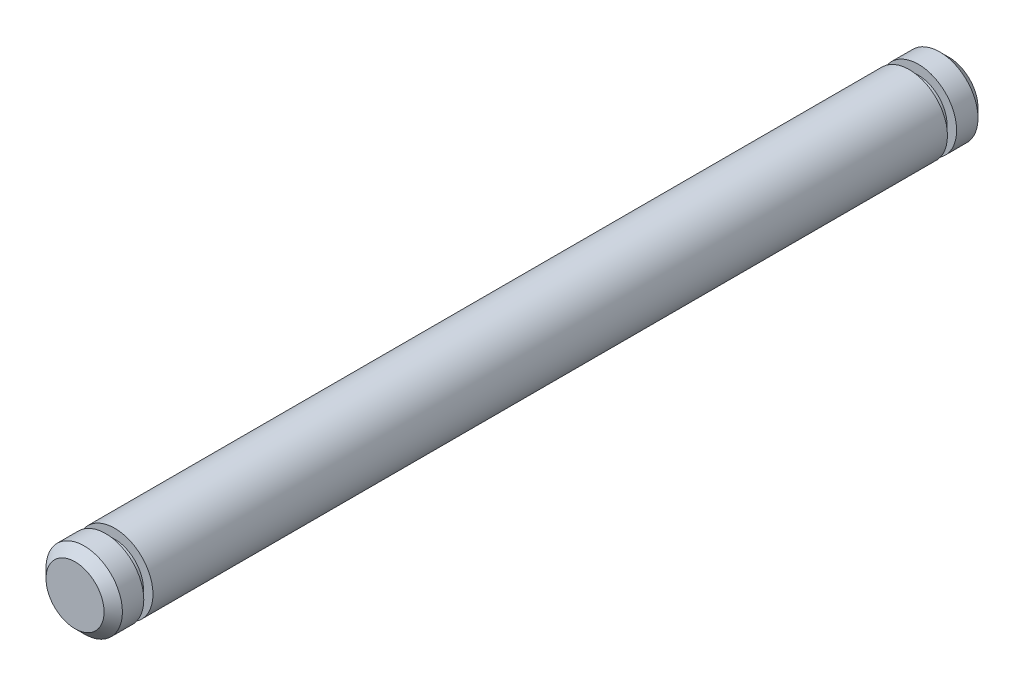
ISO-10303-21;
HEADER;
FILE_DESCRIPTION(('STEP AP214'),'2;1');
FILE_NAME('part.step','',(''),(''),'','','');
FILE_SCHEMA(('AUTOMOTIVE_DESIGN { 1 0 10303 214 1 1 1 1 }'));
ENDSEC;
DATA;
#1=APPLICATION_CONTEXT('core data for automotive mechanical design processes');
#2=APPLICATION_PROTOCOL_DEFINITION('international standard','automotive_design',2000,#1);
#3=PRODUCT_CONTEXT('',#1,'mechanical');
#4=PRODUCT('Part','Part','',(#3));
#5=PRODUCT_RELATED_PRODUCT_CATEGORY('part','',(#4));
#6=PRODUCT_DEFINITION_FORMATION('','',#4);
#7=PRODUCT_DEFINITION_CONTEXT('part definition',#1,'design');
#8=PRODUCT_DEFINITION('design','',#6,#7);
#9=PRODUCT_DEFINITION_SHAPE('','',#8);
#10=(LENGTH_UNIT() NAMED_UNIT(*) SI_UNIT(.MILLI.,.METRE.));
#11=(NAMED_UNIT(*) PLANE_ANGLE_UNIT() SI_UNIT($,.RADIAN.));
#12=(NAMED_UNIT(*) SI_UNIT($,.STERADIAN.) SOLID_ANGLE_UNIT());
#13=UNCERTAINTY_MEASURE_WITH_UNIT(LENGTH_MEASURE(1.E-05),#10,'distance_accuracy_value','');
#14=(GEOMETRIC_REPRESENTATION_CONTEXT(3) GLOBAL_UNCERTAINTY_ASSIGNED_CONTEXT((#13)) GLOBAL_UNIT_ASSIGNED_CONTEXT((#10,
#11,#12)) REPRESENTATION_CONTEXT('',''));
#15=CARTESIAN_POINT('',(0.,0.,0.));
#16=DIRECTION('',(0.,0.,1.));
#17=DIRECTION('',(1.,0.,0.));
#18=AXIS2_PLACEMENT_3D('',#15,#16,#17);
#19=CARTESIAN_POINT('',(0.,0.,16.50746));
#20=DIRECTION('',(0.,0.,-1.));
#21=DIRECTION('',(-1.,0.,0.));
#22=AXIS2_PLACEMENT_3D('',#19,#20,#21);
#23=CYLINDRICAL_SURFACE('',#22,1.5875);
#24=CARTESIAN_POINT('',(0.,0.,16.50746));
#25=DIRECTION('',(0.,0.,1.));
#26=DIRECTION('',(1.,0.,0.));
#27=AXIS2_PLACEMENT_3D('',#24,#25,#26);
#28=CIRCLE('',#27,1.5875);
#29=CARTESIAN_POINT('',(1.5875,0.,16.50746));
#30=VERTEX_POINT('',#29);
#31=EDGE_CURVE('E61',#30,#30,#28,.T.);
#32=ORIENTED_EDGE('',*,*,#31,.F.);
#33=EDGE_LOOP('',(#32));
#34=FACE_BOUND('',#33,.T.);
#35=CARTESIAN_POINT('',(0.,0.,-16.50746));
#36=DIRECTION('',(0.,0.,1.));
#37=DIRECTION('',(1.,0.,0.));
#38=AXIS2_PLACEMENT_3D('',#35,#36,#37);
#39=CIRCLE('',#38,1.5875);
#40=CARTESIAN_POINT('',(1.5875,0.,-16.50746));
#41=VERTEX_POINT('',#40);
#42=EDGE_CURVE('E58',#41,#41,#39,.T.);
#43=ORIENTED_EDGE('',*,*,#42,.T.);
#44=EDGE_LOOP('',(#43));
#45=FACE_BOUND('',#44,.T.);
#46=ADVANCED_FACE('F36',(#34,#45),#23,.T.);
#47=CARTESIAN_POINT('',(0.,0.,16.50746));
#48=DIRECTION('',(0.,0.,1.));
#49=DIRECTION('',(1.,0.,0.));
#50=AXIS2_PLACEMENT_3D('',#47,#48,#49);
#51=PLANE('',#50);
#52=CARTESIAN_POINT('',(0.,0.,16.50746));
#53=DIRECTION('',(0.,0.,1.));
#54=DIRECTION('',(1.,0.,0.));
#55=AXIS2_PLACEMENT_3D('',#52,#53,#54);
#56=CIRCLE('',#55,1.19126);
#57=CARTESIAN_POINT('',(-1.19126,0.,16.50746));
#58=VERTEX_POINT('',#57);
#59=EDGE_CURVE('E57',#58,#58,#56,.T.);
#60=ORIENTED_EDGE('',*,*,#59,.F.);
#61=EDGE_LOOP('',(#60));
#62=FACE_BOUND('',#61,.T.);
#63=ORIENTED_EDGE('',*,*,#31,.T.);
#64=EDGE_LOOP('',(#63));
#65=FACE_BOUND('',#64,.T.);
#66=ADVANCED_FACE('F99',(#62,#65),#51,.T.);
#67=CARTESIAN_POINT('',(0.,0.,-16.50746));
#68=DIRECTION('',(0.,0.,1.));
#69=DIRECTION('',(1.,0.,0.));
#70=AXIS2_PLACEMENT_3D('',#67,#68,#69);
#71=PLANE('',#70);
#72=CARTESIAN_POINT('',(0.,0.,-16.50746));
#73=DIRECTION('',(0.,0.,1.));
#74=DIRECTION('',(1.,0.,0.));
#75=AXIS2_PLACEMENT_3D('',#72,#73,#74);
#76=CIRCLE('',#75,1.19126);
#77=CARTESIAN_POINT('',(1.19126,0.,-16.50746));
#78=VERTEX_POINT('',#77);
#79=EDGE_CURVE('E72',#78,#78,#76,.T.);
#80=ORIENTED_EDGE('',*,*,#79,.T.);
#81=EDGE_LOOP('',(#80));
#82=FACE_BOUND('',#81,.T.);
#83=ORIENTED_EDGE('',*,*,#42,.F.);
#84=EDGE_LOOP('',(#83));
#85=FACE_BOUND('',#84,.T.);
#86=ADVANCED_FACE('F105',(#82,#85),#71,.F.);
#87=CARTESIAN_POINT('',(0.,0.,16.88846));
#88=DIRECTION('',(0.,0.,-1.));
#89=DIRECTION('',(-1.,0.,0.));
#90=AXIS2_PLACEMENT_3D('',#87,#88,#89);
#91=CYLINDRICAL_SURFACE('',#90,1.19126);
#92=CARTESIAN_POINT('',(0.,0.,16.88846));
#93=DIRECTION('',(0.,0.,1.));
#94=DIRECTION('',(1.,0.,0.));
#95=AXIS2_PLACEMENT_3D('',#92,#93,#94);
#96=CIRCLE('',#95,1.19126);
#97=CARTESIAN_POINT('',(-1.19126,0.,16.88846));
#98=VERTEX_POINT('',#97);
#99=EDGE_CURVE('E62',#98,#98,#96,.T.);
#100=CARTESIAN_POINT('',(-1.19126,0.,16.88846));
#101=CARTESIAN_POINT('',(-1.19126,0.,16.88449125));
#102=CARTESIAN_POINT('',(-1.19126,0.,16.8805225));
#103=CARTESIAN_POINT('',(-1.19126,0.,16.872585));
#104=CARTESIAN_POINT('',(-1.19126,0.,16.86861625));
#105=CARTESIAN_POINT('',(-1.19126,0.,16.86067875));
#106=CARTESIAN_POINT('',(-1.19126,0.,16.85671));
#107=CARTESIAN_POINT('',(-1.19126,0.,16.8487725));
#108=CARTESIAN_POINT('',(-1.19126,0.,16.84480375));
#109=CARTESIAN_POINT('',(-1.19126,0.,16.83686625));
#110=CARTESIAN_POINT('',(-1.19126,0.,16.8328975));
#111=CARTESIAN_POINT('',(-1.19126,0.,16.82496));
#112=CARTESIAN_POINT('',(-1.19126,0.,16.82099125));
#113=CARTESIAN_POINT('',(-1.19126,0.,16.81305375));
#114=CARTESIAN_POINT('',(-1.19126,0.,16.809085));
#115=CARTESIAN_POINT('',(-1.19126,0.,16.8011475));
#116=CARTESIAN_POINT('',(-1.19126,0.,16.79717875));
#117=CARTESIAN_POINT('',(-1.19126,0.,16.78924125));
#118=CARTESIAN_POINT('',(-1.19126,0.,16.7852725));
#119=CARTESIAN_POINT('',(-1.19126,0.,16.777335));
#120=CARTESIAN_POINT('',(-1.19126,0.,16.77336625));
#121=CARTESIAN_POINT('',(-1.19126,0.,16.76542875));
#122=CARTESIAN_POINT('',(-1.19126,0.,16.76146));
#123=CARTESIAN_POINT('',(-1.19126,0.,16.7535225));
#124=CARTESIAN_POINT('',(-1.19126,0.,16.74955375));
#125=CARTESIAN_POINT('',(-1.19126,0.,16.74161625));
#126=CARTESIAN_POINT('',(-1.19126,0.,16.7376475));
#127=CARTESIAN_POINT('',(-1.19126,0.,16.72971));
#128=CARTESIAN_POINT('',(-1.19126,0.,16.72574125));
#129=CARTESIAN_POINT('',(-1.19126,0.,16.71780375));
#130=CARTESIAN_POINT('',(-1.19126,0.,16.713835));
#131=CARTESIAN_POINT('',(-1.19126,0.,16.7058975));
#132=CARTESIAN_POINT('',(-1.19126,0.,16.70192875));
#133=CARTESIAN_POINT('',(-1.19126,0.,16.69399125));
#134=CARTESIAN_POINT('',(-1.19126,0.,16.6900225));
#135=CARTESIAN_POINT('',(-1.19126,0.,16.682085));
#136=CARTESIAN_POINT('',(-1.19126,0.,16.67811625));
#137=CARTESIAN_POINT('',(-1.19126,0.,16.67017875));
#138=CARTESIAN_POINT('',(-1.19126,0.,16.66621));
#139=CARTESIAN_POINT('',(-1.19126,0.,16.6582725));
#140=CARTESIAN_POINT('',(-1.19126,0.,16.65430375));
#141=CARTESIAN_POINT('',(-1.19126,0.,16.64636625));
#142=CARTESIAN_POINT('',(-1.19126,0.,16.6423975));
#143=CARTESIAN_POINT('',(-1.19126,0.,16.63446));
#144=CARTESIAN_POINT('',(-1.19126,0.,16.63049125));
#145=CARTESIAN_POINT('',(-1.19126,0.,16.62255375));
#146=CARTESIAN_POINT('',(-1.19126,0.,16.618585));
#147=CARTESIAN_POINT('',(-1.19126,0.,16.6106475));
#148=CARTESIAN_POINT('',(-1.19126,0.,16.60667875));
#149=CARTESIAN_POINT('',(-1.19126,0.,16.59874125));
#150=CARTESIAN_POINT('',(-1.19126,0.,16.5947725));
#151=CARTESIAN_POINT('',(-1.19126,0.,16.586835));
#152=CARTESIAN_POINT('',(-1.19126,0.,16.58286625));
#153=CARTESIAN_POINT('',(-1.19126,0.,16.57492875));
#154=CARTESIAN_POINT('',(-1.19126,0.,16.57096));
#155=CARTESIAN_POINT('',(-1.19126,0.,16.5630225));
#156=CARTESIAN_POINT('',(-1.19126,0.,16.55905375));
#157=CARTESIAN_POINT('',(-1.19126,0.,16.55111625));
#158=CARTESIAN_POINT('',(-1.19126,0.,16.5471475));
#159=CARTESIAN_POINT('',(-1.19126,0.,16.53921));
#160=CARTESIAN_POINT('',(-1.19126,0.,16.53524125));
#161=CARTESIAN_POINT('',(-1.19126,0.,16.52730375));
#162=CARTESIAN_POINT('',(-1.19126,0.,16.523335));
#163=CARTESIAN_POINT('',(-1.19126,0.,16.5153975));
#164=CARTESIAN_POINT('',(-1.19126,0.,16.51142875));
#165=CARTESIAN_POINT('',(-1.19126,0.,16.50746));
#166=B_SPLINE_CURVE_WITH_KNOTS('',3,(#100,#101,#102,#103,#104,#105,#106,#107,#108,#109,#110,
#111,#112,#113,#114,#115,#116,#117,#118,#119,#120,#121,#122,#123,#124,#125,#126,#127,#128,#129,
#130,#131,#132,#133,#134,#135,#136,#137,#138,#139,#140,#141,#142,#143,#144,#145,#146,#147,#148,
#149,#150,#151,#152,#153,#154,#155,#156,#157,#158,#159,#160,#161,#162,#163,#164,#165),
.UNSPECIFIED.,.F.,.F.,(4,2,2,2,2,2,2,2,2,2,2,2,2,2,2,2,2,2,2,2,2,2,2,2,2,2,2,2,2,2,2,2,4),(0.,
0.0119062499999989,0.0238124999999978,0.0357187499999967,0.0476249999999991,0.059531249999998,
0.0714374999999969,0.0833437499999992,0.0952499999999981,0.107156249999997,0.119062499999999,
0.130968749999998,0.142874999999997,0.15478125,0.166687499999998,0.178593749999997,0.1905,
0.202406249999999,0.214312499999997,0.226218749999996,0.238124999999999,0.250031249999998,
0.261937499999997,0.273843749999999,0.285749999999998,0.297656249999997,0.309562499999999,
0.321468749999998,0.333374999999997,0.345281249999999,0.357187499999998,0.369093749999997,
0.380999999999999),.UNSPECIFIED.);
#167=EDGE_CURVE('BSEAM133',#98,#58,#166,.T.);
#168=ORIENTED_EDGE('',*,*,#99,.F.);
#169=ORIENTED_EDGE('',*,*,#59,.T.);
#170=ORIENTED_EDGE('',*,*,#167,.T.);
#171=ORIENTED_EDGE('',*,*,#167,.F.);
#172=EDGE_LOOP('',(#168,#170,#169,#171));
#173=FACE_BOUND('',#172,.T.);
#174=ADVANCED_FACE('F133',(#173),#91,.T.);
#175=CARTESIAN_POINT('',(0.,0.,18.15846));
#176=DIRECTION('',(0.,0.,-1.));
#177=DIRECTION('',(-1.,0.,0.));
#178=AXIS2_PLACEMENT_3D('',#175,#176,#177);
#179=CYLINDRICAL_SURFACE('',#178,1.5875);
#180=CARTESIAN_POINT('',(0.,0.,17.77746));
#181=DIRECTION('',(0.,0.,1.));
#182=DIRECTION('',(1.,0.,0.));
#183=AXIS2_PLACEMENT_3D('',#180,#181,#182);
#184=CIRCLE('',#183,1.5875);
#185=CARTESIAN_POINT('',(1.5875,0.,17.77746));
#186=VERTEX_POINT('',#185);
#187=EDGE_CURVE('E48',#186,#186,#184,.F.);
#188=ORIENTED_EDGE('',*,*,#187,.T.);
#189=EDGE_LOOP('',(#188));
#190=FACE_BOUND('',#189,.T.);
#191=CARTESIAN_POINT('',(0.,0.,16.88846));
#192=DIRECTION('',(0.,0.,1.));
#193=DIRECTION('',(1.,0.,0.));
#194=AXIS2_PLACEMENT_3D('',#191,#192,#193);
#195=CIRCLE('',#194,1.5875);
#196=CARTESIAN_POINT('',(1.5875,0.,16.88846));
#197=VERTEX_POINT('',#196);
#198=EDGE_CURVE('E69',#197,#197,#195,.T.);
#199=ORIENTED_EDGE('',*,*,#198,.T.);
#200=EDGE_LOOP('',(#199));
#201=FACE_BOUND('',#200,.T.);
#202=ADVANCED_FACE('F128',(#190,#201),#179,.T.);
#203=CARTESIAN_POINT('',(0.,0.,18.15846));
#204=DIRECTION('',(0.,0.,1.));
#205=DIRECTION('',(1.,0.,0.));
#206=AXIS2_PLACEMENT_3D('',#203,#204,#205);
#207=PLANE('',#206);
#208=CARTESIAN_POINT('',(0.,0.,18.15846));
#209=DIRECTION('',(0.,0.,1.));
#210=DIRECTION('',(1.,0.,0.));
#211=AXIS2_PLACEMENT_3D('',#208,#209,#210);
#212=CIRCLE('',#211,1.2065);
#213=CARTESIAN_POINT('',(1.2065,0.,18.15846));
#214=VERTEX_POINT('',#213);
#215=EDGE_CURVE('E52',#214,#214,#212,.T.);
#216=ORIENTED_EDGE('',*,*,#215,.T.);
#217=EDGE_LOOP('',(#216));
#218=FACE_BOUND('',#217,.T.);
#219=ADVANCED_FACE('F120',(#218),#207,.T.);
#220=CARTESIAN_POINT('',(0.,0.,16.88846));
#221=DIRECTION('',(0.,0.,1.));
#222=DIRECTION('',(1.,0.,0.));
#223=AXIS2_PLACEMENT_3D('',#220,#221,#222);
#224=PLANE('',#223);
#225=ORIENTED_EDGE('',*,*,#99,.T.);
#226=EDGE_LOOP('',(#225));
#227=FACE_BOUND('',#226,.T.);
#228=ORIENTED_EDGE('',*,*,#198,.F.);
#229=EDGE_LOOP('',(#228));
#230=FACE_BOUND('',#229,.T.);
#231=ADVANCED_FACE('F115',(#227,#230),#224,.F.);
#232=CARTESIAN_POINT('',(0.,0.,18.15846));
#233=DIRECTION('',(0.,0.,-1.));
#234=DIRECTION('',(-1.,0.,0.));
#235=AXIS2_PLACEMENT_3D('',#232,#233,#234);
#236=CONICAL_SURFACE('',#235,1.2065,0.785398163397446);
#237=ORIENTED_EDGE('',*,*,#187,.F.);
#238=EDGE_LOOP('',(#237));
#239=FACE_BOUND('',#238,.T.);
#240=ORIENTED_EDGE('',*,*,#215,.F.);
#241=EDGE_LOOP('',(#240));
#242=FACE_BOUND('',#241,.T.);
#243=ADVANCED_FACE('F94',(#239,#242),#236,.T.);
#244=CARTESIAN_POINT('',(0.,0.,-16.88846));
#245=DIRECTION('',(0.,0.,1.));
#246=DIRECTION('',(1.,0.,0.));
#247=AXIS2_PLACEMENT_3D('',#244,#245,#246);
#248=CYLINDRICAL_SURFACE('',#247,1.19126);
#249=CARTESIAN_POINT('',(0.,0.,-16.88846));
#250=DIRECTION('',(0.,0.,1.));
#251=DIRECTION('',(1.,0.,0.));
#252=AXIS2_PLACEMENT_3D('',#249,#250,#251);
#253=CIRCLE('',#252,1.19126);
#254=CARTESIAN_POINT('',(1.19126,0.,-16.88846));
#255=VERTEX_POINT('',#254);
#256=EDGE_CURVE('E75',#255,#255,#253,.T.);
#257=CARTESIAN_POINT('',(1.19126,0.,-16.88846));
#258=CARTESIAN_POINT('',(1.19126,0.,-16.88449125));
#259=CARTESIAN_POINT('',(1.19126,0.,-16.8805225));
#260=CARTESIAN_POINT('',(1.19126,0.,-16.872585));
#261=CARTESIAN_POINT('',(1.19126,0.,-16.86861625));
#262=CARTESIAN_POINT('',(1.19126,0.,-16.86067875));
#263=CARTESIAN_POINT('',(1.19126,0.,-16.85671));
#264=CARTESIAN_POINT('',(1.19126,0.,-16.8487725));
#265=CARTESIAN_POINT('',(1.19126,0.,-16.84480375));
#266=CARTESIAN_POINT('',(1.19126,0.,-16.83686625));
#267=CARTESIAN_POINT('',(1.19126,0.,-16.8328975));
#268=CARTESIAN_POINT('',(1.19126,0.,-16.82496));
#269=CARTESIAN_POINT('',(1.19126,0.,-16.82099125));
#270=CARTESIAN_POINT('',(1.19126,0.,-16.81305375));
#271=CARTESIAN_POINT('',(1.19126,0.,-16.809085));
#272=CARTESIAN_POINT('',(1.19126,0.,-16.8011475));
#273=CARTESIAN_POINT('',(1.19126,0.,-16.79717875));
#274=CARTESIAN_POINT('',(1.19126,0.,-16.78924125));
#275=CARTESIAN_POINT('',(1.19126,0.,-16.7852725));
#276=CARTESIAN_POINT('',(1.19126,0.,-16.777335));
#277=CARTESIAN_POINT('',(1.19126,0.,-16.77336625));
#278=CARTESIAN_POINT('',(1.19126,0.,-16.76542875));
#279=CARTESIAN_POINT('',(1.19126,0.,-16.76146));
#280=CARTESIAN_POINT('',(1.19126,0.,-16.7535225));
#281=CARTESIAN_POINT('',(1.19126,0.,-16.74955375));
#282=CARTESIAN_POINT('',(1.19126,0.,-16.74161625));
#283=CARTESIAN_POINT('',(1.19126,0.,-16.7376475));
#284=CARTESIAN_POINT('',(1.19126,0.,-16.72971));
#285=CARTESIAN_POINT('',(1.19126,0.,-16.72574125));
#286=CARTESIAN_POINT('',(1.19126,0.,-16.71780375));
#287=CARTESIAN_POINT('',(1.19126,0.,-16.713835));
#288=CARTESIAN_POINT('',(1.19126,0.,-16.7058975));
#289=CARTESIAN_POINT('',(1.19126,0.,-16.70192875));
#290=CARTESIAN_POINT('',(1.19126,0.,-16.69399125));
#291=CARTESIAN_POINT('',(1.19126,0.,-16.6900225));
#292=CARTESIAN_POINT('',(1.19126,0.,-16.682085));
#293=CARTESIAN_POINT('',(1.19126,0.,-16.67811625));
#294=CARTESIAN_POINT('',(1.19126,0.,-16.67017875));
#295=CARTESIAN_POINT('',(1.19126,0.,-16.66621));
#296=CARTESIAN_POINT('',(1.19126,0.,-16.6582725));
#297=CARTESIAN_POINT('',(1.19126,0.,-16.65430375));
#298=CARTESIAN_POINT('',(1.19126,0.,-16.64636625));
#299=CARTESIAN_POINT('',(1.19126,0.,-16.6423975));
#300=CARTESIAN_POINT('',(1.19126,0.,-16.63446));
#301=CARTESIAN_POINT('',(1.19126,0.,-16.63049125));
#302=CARTESIAN_POINT('',(1.19126,0.,-16.62255375));
#303=CARTESIAN_POINT('',(1.19126,0.,-16.618585));
#304=CARTESIAN_POINT('',(1.19126,0.,-16.6106475));
#305=CARTESIAN_POINT('',(1.19126,0.,-16.60667875));
#306=CARTESIAN_POINT('',(1.19126,0.,-16.59874125));
#307=CARTESIAN_POINT('',(1.19126,0.,-16.5947725));
#308=CARTESIAN_POINT('',(1.19126,0.,-16.586835));
#309=CARTESIAN_POINT('',(1.19126,0.,-16.58286625));
#310=CARTESIAN_POINT('',(1.19126,0.,-16.57492875));
#311=CARTESIAN_POINT('',(1.19126,0.,-16.57096));
#312=CARTESIAN_POINT('',(1.19126,0.,-16.5630225));
#313=CARTESIAN_POINT('',(1.19126,0.,-16.55905375));
#314=CARTESIAN_POINT('',(1.19126,0.,-16.55111625));
#315=CARTESIAN_POINT('',(1.19126,0.,-16.5471475));
#316=CARTESIAN_POINT('',(1.19126,0.,-16.53921));
#317=CARTESIAN_POINT('',(1.19126,0.,-16.53524125));
#318=CARTESIAN_POINT('',(1.19126,0.,-16.52730375));
#319=CARTESIAN_POINT('',(1.19126,0.,-16.523335));
#320=CARTESIAN_POINT('',(1.19126,0.,-16.5153975));
#321=CARTESIAN_POINT('',(1.19126,0.,-16.51142875));
#322=CARTESIAN_POINT('',(1.19126,0.,-16.50746));
#323=B_SPLINE_CURVE_WITH_KNOTS('',3,(#257,#258,#259,#260,#261,#262,#263,#264,#265,#266,#267,
#268,#269,#270,#271,#272,#273,#274,#275,#276,#277,#278,#279,#280,#281,#282,#283,#284,#285,#286,
#287,#288,#289,#290,#291,#292,#293,#294,#295,#296,#297,#298,#299,#300,#301,#302,#303,#304,#305,
#306,#307,#308,#309,#310,#311,#312,#313,#314,#315,#316,#317,#318,#319,#320,#321,#322),
.UNSPECIFIED.,.F.,.F.,(4,2,2,2,2,2,2,2,2,2,2,2,2,2,2,2,2,2,2,2,2,2,2,2,2,2,2,2,2,2,2,2,4),(0.,
0.0119062500000024,0.0238125000000013,0.0357187500000002,0.0476250000000025,0.0595312500000014,
0.0714375000000003,0.0833437500000027,0.0952500000000016,0.10715625,0.119062500000003,
0.130968750000002,0.142875000000001,0.154781250000003,0.166687500000002,0.178593750000001,
0.1905,0.202406250000002,0.214312500000001,0.22621875,0.238125000000002,0.250031250000001,
0.2619375,0.273843750000002,0.285750000000001,0.29765625,0.309562500000003,0.321468750000001,
0.333375,0.345281250000003,0.357187500000002,0.36909375,0.380999999999999),.UNSPECIFIED.);
#324=EDGE_CURVE('BSEAM87',#255,#78,#323,.T.);
#325=ORIENTED_EDGE('',*,*,#256,.T.);
#326=ORIENTED_EDGE('',*,*,#79,.F.);
#327=ORIENTED_EDGE('',*,*,#324,.T.);
#328=ORIENTED_EDGE('',*,*,#324,.F.);
#329=EDGE_LOOP('',(#325,#327,#326,#328));
#330=FACE_BOUND('',#329,.T.);
#331=ADVANCED_FACE('F87',(#330),#248,.T.);
#332=CARTESIAN_POINT('',(0.,0.,-18.15846));
#333=DIRECTION('',(0.,0.,1.));
#334=DIRECTION('',(1.,0.,0.));
#335=AXIS2_PLACEMENT_3D('',#332,#333,#334);
#336=CYLINDRICAL_SURFACE('',#335,1.5875);
#337=CARTESIAN_POINT('',(0.,0.,-17.77746));
#338=DIRECTION('',(0.,0.,-1.));
#339=DIRECTION('',(-1.,0.,0.));
#340=AXIS2_PLACEMENT_3D('',#337,#338,#339);
#341=CIRCLE('',#340,1.5875);
#342=CARTESIAN_POINT('',(-1.5875,0.,-17.77746));
#343=VERTEX_POINT('',#342);
#344=EDGE_CURVE('E44',#343,#343,#341,.F.);
#345=ORIENTED_EDGE('',*,*,#344,.T.);
#346=EDGE_LOOP('',(#345));
#347=FACE_BOUND('',#346,.T.);
#348=CARTESIAN_POINT('',(0.,0.,-16.88846));
#349=DIRECTION('',(0.,0.,1.));
#350=DIRECTION('',(1.,0.,0.));
#351=AXIS2_PLACEMENT_3D('',#348,#349,#350);
#352=CIRCLE('',#351,1.5875);
#353=CARTESIAN_POINT('',(1.5875,0.,-16.88846));
#354=VERTEX_POINT('',#353);
#355=EDGE_CURVE('E78',#354,#354,#352,.T.);
#356=ORIENTED_EDGE('',*,*,#355,.F.);
#357=EDGE_LOOP('',(#356));
#358=FACE_BOUND('',#357,.T.);
#359=ADVANCED_FACE('F84',(#347,#358),#336,.T.);
#360=CARTESIAN_POINT('',(0.,0.,-18.15846));
#361=DIRECTION('',(0.,0.,-1.));
#362=DIRECTION('',(1.,0.,0.));
#363=AXIS2_PLACEMENT_3D('',#360,#361,#362);
#364=PLANE('',#363);
#365=CARTESIAN_POINT('',(0.,0.,-18.15846));
#366=DIRECTION('',(0.,0.,-1.));
#367=DIRECTION('',(-1.,0.,0.));
#368=AXIS2_PLACEMENT_3D('',#365,#366,#367);
#369=CIRCLE('',#368,1.2065);
#370=CARTESIAN_POINT('',(-1.2065,0.,-18.15846));
#371=VERTEX_POINT('',#370);
#372=EDGE_CURVE('E10',#371,#371,#369,.T.);
#373=ORIENTED_EDGE('',*,*,#372,.T.);
#374=EDGE_LOOP('',(#373));
#375=FACE_BOUND('',#374,.T.);
#376=ADVANCED_FACE('F86',(#375),#364,.T.);
#377=CARTESIAN_POINT('',(0.,0.,-16.88846));
#378=DIRECTION('',(0.,0.,-1.));
#379=DIRECTION('',(1.,0.,0.));
#380=AXIS2_PLACEMENT_3D('',#377,#378,#379);
#381=PLANE('',#380);
#382=ORIENTED_EDGE('',*,*,#256,.F.);
#383=EDGE_LOOP('',(#382));
#384=FACE_BOUND('',#383,.T.);
#385=ORIENTED_EDGE('',*,*,#355,.T.);
#386=EDGE_LOOP('',(#385));
#387=FACE_BOUND('',#386,.T.);
#388=ADVANCED_FACE('F82',(#384,#387),#381,.F.);
#389=CARTESIAN_POINT('',(0.,0.,-17.77746));
#390=DIRECTION('',(0.,0.,1.));
#391=DIRECTION('',(1.,0.,0.));
#392=AXIS2_PLACEMENT_3D('',#389,#390,#391);
#393=CONICAL_SURFACE('',#392,1.5875,0.78539816339745);
#394=ORIENTED_EDGE('',*,*,#372,.F.);
#395=EDGE_LOOP('',(#394));
#396=FACE_BOUND('',#395,.T.);
#397=ORIENTED_EDGE('',*,*,#344,.F.);
#398=EDGE_LOOP('',(#397));
#399=FACE_BOUND('',#398,.T.);
#400=ADVANCED_FACE('F39',(#396,#399),#393,.T.);
#401=CLOSED_SHELL('',(#46,#66,#86,#174,#202,#219,#231,#243,#331,#359,#376,#388,#400));
#402=MANIFOLD_SOLID_BREP('B2',#401);
#403=ADVANCED_BREP_SHAPE_REPRESENTATION('',(#18,#402),#14);
#404=SHAPE_DEFINITION_REPRESENTATION(#9,#403);
ENDSEC;
END-ISO-10303-21;
